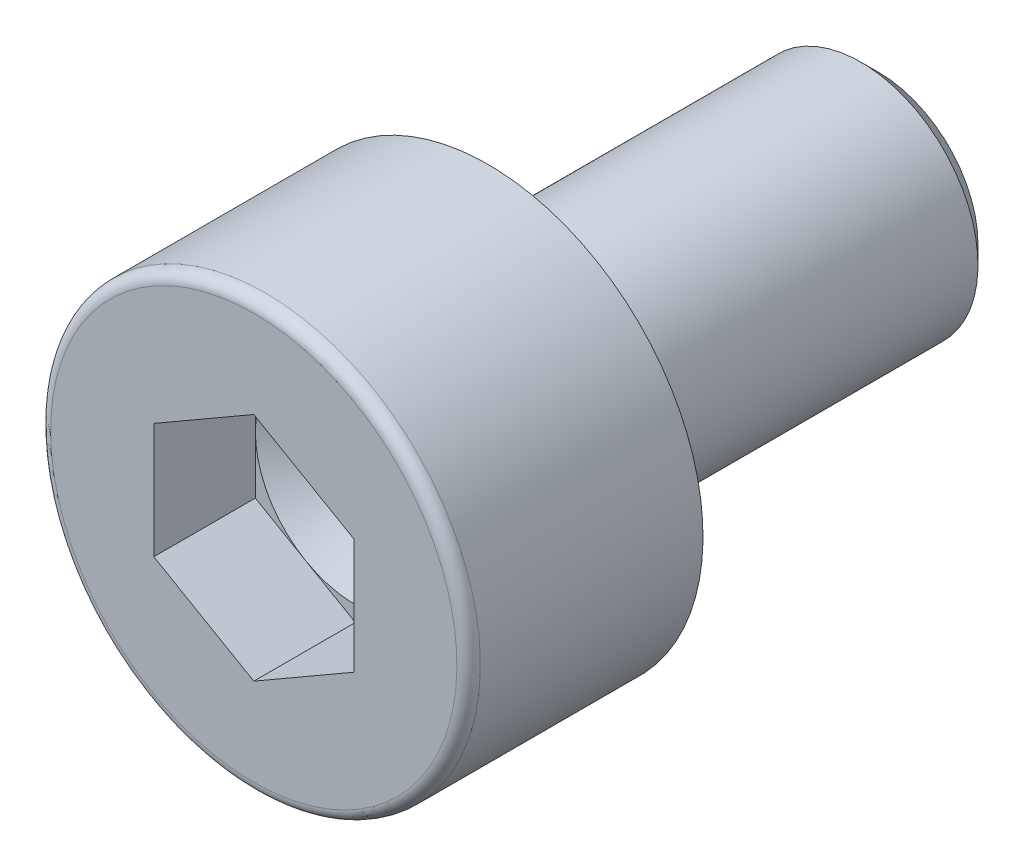
ISO-10303-21;
HEADER;
FILE_DESCRIPTION(('STEP AP214'),'2;1');
FILE_NAME('part.step','',(''),(''),'','','');
FILE_SCHEMA(('AUTOMOTIVE_DESIGN { 1 0 10303 214 1 1 1 1 }'));
ENDSEC;
DATA;
#1=APPLICATION_CONTEXT('core data for automotive mechanical design processes');
#2=APPLICATION_PROTOCOL_DEFINITION('international standard','automotive_design',2000,#1);
#3=PRODUCT_CONTEXT('',#1,'mechanical');
#4=PRODUCT('Part','Part','',(#3));
#5=PRODUCT_RELATED_PRODUCT_CATEGORY('part','',(#4));
#6=PRODUCT_DEFINITION_FORMATION('','',#4);
#7=PRODUCT_DEFINITION_CONTEXT('part definition',#1,'design');
#8=PRODUCT_DEFINITION('design','',#6,#7);
#9=PRODUCT_DEFINITION_SHAPE('','',#8);
#10=(LENGTH_UNIT() NAMED_UNIT(*) SI_UNIT(.MILLI.,.METRE.));
#11=(NAMED_UNIT(*) PLANE_ANGLE_UNIT() SI_UNIT($,.RADIAN.));
#12=(NAMED_UNIT(*) SI_UNIT($,.STERADIAN.) SOLID_ANGLE_UNIT());
#13=UNCERTAINTY_MEASURE_WITH_UNIT(LENGTH_MEASURE(1.E-05),#10,'distance_accuracy_value','');
#14=(GEOMETRIC_REPRESENTATION_CONTEXT(3) GLOBAL_UNCERTAINTY_ASSIGNED_CONTEXT((#13)) GLOBAL_UNIT_ASSIGNED_CONTEXT((#10,
#11,#12)) REPRESENTATION_CONTEXT('',''));
#15=CARTESIAN_POINT('',(0.,0.,0.));
#16=DIRECTION('',(0.,0.,1.));
#17=DIRECTION('',(1.,0.,0.));
#18=AXIS2_PLACEMENT_3D('',#15,#16,#17);
#19=CARTESIAN_POINT('',(0.,1.47801668912544,1.7));
#20=DIRECTION('',(0.,0.,1.));
#21=DIRECTION('',(1.,0.,0.));
#22=AXIS2_PLACEMENT_3D('',#19,#20,#21);
#23=PLANE('',#22);
#24=DIRECTION('',(0.,-1.,0.));
#25=VECTOR('',#24,1.);
#26=CARTESIAN_POINT('',(-1.28,0.739008344562725,1.7));
#27=LINE('',#26,#25);
#28=CARTESIAN_POINT('',(-1.28,0.739008344562725,1.7));
#29=VERTEX_POINT('',#28);
#30=CARTESIAN_POINT('',(-1.28,0.,1.7));
#31=VERTEX_POINT('',#30);
#32=EDGE_CURVE('E145',#29,#31,#27,.T.);
#33=ORIENTED_EDGE('',*,*,#32,.T.);
#34=CARTESIAN_POINT('',(0.,0.,1.7));
#35=DIRECTION('',(0.,0.,-1.));
#36=DIRECTION('',(-1.,0.,0.));
#37=AXIS2_PLACEMENT_3D('',#34,#35,#36);
#38=CIRCLE('',#37,1.28);
#39=CARTESIAN_POINT('',(-0.64,1.10851251684409,1.7));
#40=VERTEX_POINT('',#39);
#41=EDGE_CURVE('E28',#31,#40,#38,.T.);
#42=ORIENTED_EDGE('',*,*,#41,.T.);
#43=DIRECTION('',(-0.866025403784439,-0.5,0.));
#44=VECTOR('',#43,1.);
#45=CARTESIAN_POINT('',(0.,1.47801668912544,1.7));
#46=LINE('',#45,#44);
#47=EDGE_CURVE('E209',#40,#29,#46,.T.);
#48=ORIENTED_EDGE('',*,*,#47,.T.);
#49=EDGE_LOOP('',(#33,#42,#48));
#50=FACE_BOUND('',#49,.T.);
#51=ADVANCED_FACE('F17',(#50),#23,.T.);
#52=CARTESIAN_POINT('',(0.,1.47801668912544,1.7));
#53=VERTEX_POINT('',#52);
#54=EDGE_CURVE('E214',#53,#40,#46,.T.);
#55=ORIENTED_EDGE('',*,*,#54,.T.);
#56=CARTESIAN_POINT('',(0.64,1.10851251684409,1.7));
#57=VERTEX_POINT('',#56);
#58=EDGE_CURVE('E11',#40,#57,#38,.T.);
#59=ORIENTED_EDGE('',*,*,#58,.T.);
#60=DIRECTION('',(-0.866025403784439,0.5,0.));
#61=VECTOR('',#60,1.);
#62=CARTESIAN_POINT('',(1.28,0.739008344562725,1.7));
#63=LINE('',#62,#61);
#64=EDGE_CURVE('E171',#57,#53,#63,.T.);
#65=ORIENTED_EDGE('',*,*,#64,.T.);
#66=EDGE_LOOP('',(#55,#59,#65));
#67=FACE_BOUND('',#66,.T.);
#68=ADVANCED_FACE('F106',(#67),#23,.T.);
#69=CARTESIAN_POINT('',(1.28,0.739008344562725,1.7));
#70=VERTEX_POINT('',#69);
#71=EDGE_CURVE('E215',#70,#57,#63,.T.);
#72=ORIENTED_EDGE('',*,*,#71,.T.);
#73=CARTESIAN_POINT('',(1.28,0.,1.7));
#74=VERTEX_POINT('',#73);
#75=EDGE_CURVE('E26',#57,#74,#38,.T.);
#76=ORIENTED_EDGE('',*,*,#75,.T.);
#77=DIRECTION('',(0.,1.,0.));
#78=VECTOR('',#77,1.);
#79=CARTESIAN_POINT('',(1.28,-0.739008344562725,1.7));
#80=LINE('',#79,#78);
#81=EDGE_CURVE('E150',#74,#70,#80,.T.);
#82=ORIENTED_EDGE('',*,*,#81,.T.);
#83=EDGE_LOOP('',(#72,#76,#82));
#84=FACE_BOUND('',#83,.T.);
#85=ADVANCED_FACE('F113',(#84),#23,.T.);
#86=CARTESIAN_POINT('',(1.28,-0.739008344562725,1.7));
#87=VERTEX_POINT('',#86);
#88=EDGE_CURVE('E151',#87,#74,#80,.T.);
#89=ORIENTED_EDGE('',*,*,#88,.T.);
#90=CARTESIAN_POINT('',(0.64,-1.10851251684409,1.7));
#91=VERTEX_POINT('',#90);
#92=EDGE_CURVE('E206',#74,#91,#38,.T.);
#93=ORIENTED_EDGE('',*,*,#92,.T.);
#94=DIRECTION('',(0.866025403784439,0.5,0.));
#95=VECTOR('',#94,1.);
#96=CARTESIAN_POINT('',(0.,-1.47801668912544,1.7));
#97=LINE('',#96,#95);
#98=EDGE_CURVE('E140',#91,#87,#97,.T.);
#99=ORIENTED_EDGE('',*,*,#98,.T.);
#100=EDGE_LOOP('',(#89,#93,#99));
#101=FACE_BOUND('',#100,.T.);
#102=ADVANCED_FACE('F129',(#101),#23,.T.);
#103=CARTESIAN_POINT('',(0.,-1.47801668912544,1.7));
#104=VERTEX_POINT('',#103);
#105=EDGE_CURVE('E143',#104,#91,#97,.T.);
#106=ORIENTED_EDGE('',*,*,#105,.T.);
#107=CARTESIAN_POINT('',(-0.64,-1.10851251684409,1.7));
#108=VERTEX_POINT('',#107);
#109=EDGE_CURVE('E204',#91,#108,#38,.T.);
#110=ORIENTED_EDGE('',*,*,#109,.T.);
#111=DIRECTION('',(0.866025403784439,-0.5,0.));
#112=VECTOR('',#111,1.);
#113=CARTESIAN_POINT('',(-1.28,-0.739008344562725,1.7));
#114=LINE('',#113,#112);
#115=EDGE_CURVE('E141',#108,#104,#114,.T.);
#116=ORIENTED_EDGE('',*,*,#115,.T.);
#117=EDGE_LOOP('',(#106,#110,#116));
#118=FACE_BOUND('',#117,.T.);
#119=ADVANCED_FACE('F119',(#118),#23,.T.);
#120=CARTESIAN_POINT('',(-1.28,-0.739008344562725,1.7));
#121=VERTEX_POINT('',#120);
#122=EDGE_CURVE('E133',#121,#108,#114,.T.);
#123=ORIENTED_EDGE('',*,*,#122,.T.);
#124=EDGE_CURVE('E134',#108,#31,#38,.T.);
#125=ORIENTED_EDGE('',*,*,#124,.T.);
#126=EDGE_CURVE('E136',#31,#121,#27,.T.);
#127=ORIENTED_EDGE('',*,*,#126,.T.);
#128=EDGE_LOOP('',(#123,#125,#127));
#129=FACE_BOUND('',#128,.T.);
#130=ADVANCED_FACE('F108',(#129),#23,.T.);
#131=CARTESIAN_POINT('',(0.,0.,3.));
#132=DIRECTION('',(0.,0.,-1.));
#133=DIRECTION('',(0.,1.,0.));
#134=AXIS2_PLACEMENT_3D('',#131,#132,#133);
#135=PLANE('',#134);
#136=DIRECTION('',(-0.866025403784439,-0.5,0.));
#137=VECTOR('',#136,1.);
#138=CARTESIAN_POINT('',(0.,1.47801668912544,3.));
#139=LINE('',#138,#137);
#140=CARTESIAN_POINT('',(0.,1.47801668912544,3.));
#141=VERTEX_POINT('',#140);
#142=CARTESIAN_POINT('',(-1.28,0.739008344562725,3.));
#143=VERTEX_POINT('',#142);
#144=EDGE_CURVE('E156',#141,#143,#139,.T.);
#145=ORIENTED_EDGE('',*,*,#144,.F.);
#146=DIRECTION('',(-0.866025403784439,0.5,0.));
#147=VECTOR('',#146,1.);
#148=CARTESIAN_POINT('',(1.28,0.739008344562725,3.));
#149=LINE('',#148,#147);
#150=CARTESIAN_POINT('',(1.28,0.739008344562725,3.));
#151=VERTEX_POINT('',#150);
#152=EDGE_CURVE('E42',#151,#141,#149,.T.);
#153=ORIENTED_EDGE('',*,*,#152,.F.);
#154=DIRECTION('',(0.,1.,0.));
#155=VECTOR('',#154,1.);
#156=CARTESIAN_POINT('',(1.28,-0.739008344562725,3.));
#157=LINE('',#156,#155);
#158=CARTESIAN_POINT('',(1.28,-0.739008344562725,3.));
#159=VERTEX_POINT('',#158);
#160=EDGE_CURVE('E168',#159,#151,#157,.T.);
#161=ORIENTED_EDGE('',*,*,#160,.F.);
#162=DIRECTION('',(0.866025403784439,0.5,0.));
#163=VECTOR('',#162,1.);
#164=CARTESIAN_POINT('',(0.,-1.47801668912544,3.));
#165=LINE('',#164,#163);
#166=CARTESIAN_POINT('',(0.,-1.47801668912544,3.));
#167=VERTEX_POINT('',#166);
#168=EDGE_CURVE('E165',#167,#159,#165,.T.);
#169=ORIENTED_EDGE('',*,*,#168,.F.);
#170=DIRECTION('',(0.866025403784439,-0.5,0.));
#171=VECTOR('',#170,1.);
#172=CARTESIAN_POINT('',(-1.28,-0.739008344562725,3.));
#173=LINE('',#172,#171);
#174=CARTESIAN_POINT('',(-1.28,-0.739008344562725,3.));
#175=VERTEX_POINT('',#174);
#176=EDGE_CURVE('E162',#175,#167,#173,.T.);
#177=ORIENTED_EDGE('',*,*,#176,.F.);
#178=DIRECTION('',(0.,-1.,0.));
#179=VECTOR('',#178,1.);
#180=CARTESIAN_POINT('',(-1.28,0.739008344562725,3.));
#181=LINE('',#180,#179);
#182=EDGE_CURVE('E159',#143,#175,#181,.T.);
#183=ORIENTED_EDGE('',*,*,#182,.F.);
#184=EDGE_LOOP('',(#145,#153,#161,#169,#177,#183));
#185=FACE_BOUND('',#184,.T.);
#186=CARTESIAN_POINT('',(0.,0.,3.));
#187=DIRECTION('',(0.,0.,-1.));
#188=DIRECTION('',(0.,1.,0.));
#189=AXIS2_PLACEMENT_3D('',#186,#187,#188);
#190=CIRCLE('',#189,2.6);
#191=CARTESIAN_POINT('',(0.,2.6,3.));
#192=VERTEX_POINT('',#191);
#193=EDGE_CURVE('E192',#192,#192,#190,.F.);
#194=ORIENTED_EDGE('',*,*,#193,.T.);
#195=EDGE_LOOP('',(#194));
#196=FACE_BOUND('',#195,.T.);
#197=ADVANCED_FACE('F118',(#185,#196),#135,.F.);
#198=CARTESIAN_POINT('',(0.,0.,3.));
#199=DIRECTION('',(0.,0.,1.));
#200=DIRECTION('',(0.,-1.,0.));
#201=AXIS2_PLACEMENT_3D('',#198,#199,#200);
#202=CYLINDRICAL_SURFACE('',#201,2.75);
#203=CARTESIAN_POINT('',(0.,0.,2.85));
#204=DIRECTION('',(0.,0.,-1.));
#205=DIRECTION('',(0.,1.,0.));
#206=AXIS2_PLACEMENT_3D('',#203,#204,#205);
#207=CIRCLE('',#206,2.75);
#208=CARTESIAN_POINT('',(0.,2.75,2.85));
#209=VERTEX_POINT('',#208);
#210=EDGE_CURVE('E195',#209,#209,#207,.T.);
#211=ORIENTED_EDGE('',*,*,#210,.T.);
#212=EDGE_LOOP('',(#211));
#213=FACE_BOUND('',#212,.T.);
#214=CARTESIAN_POINT('',(0.,0.,0.));
#215=DIRECTION('',(0.,0.,1.));
#216=DIRECTION('',(0.,-1.,0.));
#217=AXIS2_PLACEMENT_3D('',#214,#215,#216);
#218=CIRCLE('',#217,2.75);
#219=CARTESIAN_POINT('',(0.,-2.75,0.));
#220=VERTEX_POINT('',#219);
#221=EDGE_CURVE('E174',#220,#220,#218,.T.);
#222=ORIENTED_EDGE('',*,*,#221,.T.);
#223=EDGE_LOOP('',(#222));
#224=FACE_BOUND('',#223,.T.);
#225=ADVANCED_FACE('F126',(#213,#224),#202,.T.);
#226=CARTESIAN_POINT('',(0.,2.75,0.));
#227=DIRECTION('',(0.,0.,1.));
#228=DIRECTION('',(0.,-1.,0.));
#229=AXIS2_PLACEMENT_3D('',#226,#227,#228);
#230=PLANE('',#229);
#231=CARTESIAN_POINT('',(0.,0.,0.));
#232=DIRECTION('',(0.,0.,1.));
#233=DIRECTION('',(0.,-1.,0.));
#234=AXIS2_PLACEMENT_3D('',#231,#232,#233);
#235=CIRCLE('',#234,1.6);
#236=CARTESIAN_POINT('',(0.,-1.6,0.));
#237=VERTEX_POINT('',#236);
#238=EDGE_CURVE('E197',#237,#237,#235,.T.);
#239=ORIENTED_EDGE('',*,*,#238,.T.);
#240=EDGE_LOOP('',(#239));
#241=FACE_BOUND('',#240,.T.);
#242=ORIENTED_EDGE('',*,*,#221,.F.);
#243=EDGE_LOOP('',(#242));
#244=FACE_BOUND('',#243,.T.);
#245=ADVANCED_FACE('F264',(#241,#244),#230,.F.);
#246=CARTESIAN_POINT('',(0.,0.,3.));
#247=DIRECTION('',(0.,0.,1.));
#248=DIRECTION('',(0.,-1.,0.));
#249=AXIS2_PLACEMENT_3D('',#246,#247,#248);
#250=CYLINDRICAL_SURFACE('',#249,1.5);
#251=CARTESIAN_POINT('',(0.,0.,-0.1));
#252=DIRECTION('',(0.,0.,1.));
#253=DIRECTION('',(0.,-1.,0.));
#254=AXIS2_PLACEMENT_3D('',#251,#252,#253);
#255=CIRCLE('',#254,1.5);
#256=CARTESIAN_POINT('',(0.,-1.5,-0.1));
#257=VERTEX_POINT('',#256);
#258=EDGE_CURVE('E21',#257,#257,#255,.F.);
#259=ORIENTED_EDGE('',*,*,#258,.T.);
#260=EDGE_LOOP('',(#259));
#261=FACE_BOUND('',#260,.T.);
#262=CARTESIAN_POINT('',(0.,0.,-4.77));
#263=DIRECTION('',(0.,0.,1.));
#264=DIRECTION('',(0.,-1.,0.));
#265=AXIS2_PLACEMENT_3D('',#262,#263,#264);
#266=CIRCLE('',#265,1.5);
#267=CARTESIAN_POINT('',(0.,-1.5,-4.77));
#268=VERTEX_POINT('',#267);
#269=EDGE_CURVE('E186',#268,#268,#266,.T.);
#270=ORIENTED_EDGE('',*,*,#269,.T.);
#271=EDGE_LOOP('',(#270));
#272=FACE_BOUND('',#271,.T.);
#273=ADVANCED_FACE('F260',(#261,#272),#250,.T.);
#274=CARTESIAN_POINT('',(0.,1.5,-5.));
#275=DIRECTION('',(0.,0.,1.));
#276=DIRECTION('',(0.,-1.,0.));
#277=AXIS2_PLACEMENT_3D('',#274,#275,#276);
#278=PLANE('',#277);
#279=CARTESIAN_POINT('',(0.,0.,-5.));
#280=DIRECTION('',(0.,0.,1.));
#281=DIRECTION('',(0.,-1.,0.));
#282=AXIS2_PLACEMENT_3D('',#279,#280,#281);
#283=CIRCLE('',#282,1.27);
#284=CARTESIAN_POINT('',(0.,-1.27,-5.));
#285=VERTEX_POINT('',#284);
#286=EDGE_CURVE('E189',#285,#285,#283,.F.);
#287=ORIENTED_EDGE('',*,*,#286,.T.);
#288=EDGE_LOOP('',(#287));
#289=FACE_BOUND('',#288,.T.);
#290=ADVANCED_FACE('F256',(#289),#278,.F.);
#291=CARTESIAN_POINT('',(0.,0.,-4.77));
#292=DIRECTION('',(0.,0.,1.));
#293=DIRECTION('',(0.,-1.,0.));
#294=AXIS2_PLACEMENT_3D('',#291,#292,#293);
#295=CONICAL_SURFACE('',#294,1.5,0.785398163397453);
#296=ORIENTED_EDGE('',*,*,#286,.F.);
#297=EDGE_LOOP('',(#296));
#298=FACE_BOUND('',#297,.T.);
#299=ORIENTED_EDGE('',*,*,#269,.F.);
#300=EDGE_LOOP('',(#299));
#301=FACE_BOUND('',#300,.T.);
#302=ADVANCED_FACE('F259',(#298,#301),#295,.T.);
#303=CARTESIAN_POINT('',(0.,0.,2.85));
#304=DIRECTION('',(0.,0.,-1.));
#305=DIRECTION('',(0.,1.,0.));
#306=AXIS2_PLACEMENT_3D('',#303,#304,#305);
#307=TOROIDAL_SURFACE('',#306,2.6,0.15);
#308=ORIENTED_EDGE('',*,*,#210,.F.);
#309=EDGE_LOOP('',(#308));
#310=FACE_BOUND('',#309,.T.);
#311=ORIENTED_EDGE('',*,*,#193,.F.);
#312=EDGE_LOOP('',(#311));
#313=FACE_BOUND('',#312,.T.);
#314=ADVANCED_FACE('F271',(#310,#313),#307,.T.);
#315=CARTESIAN_POINT('',(0.,0.,-0.1));
#316=DIRECTION('',(0.,0.,1.));
#317=DIRECTION('',(0.,-1.,0.));
#318=AXIS2_PLACEMENT_3D('',#315,#316,#317);
#319=TOROIDAL_SURFACE('',#318,1.6,0.1);
#320=ORIENTED_EDGE('',*,*,#258,.F.);
#321=EDGE_LOOP('',(#320));
#322=FACE_BOUND('',#321,.T.);
#323=ORIENTED_EDGE('',*,*,#238,.F.);
#324=EDGE_LOOP('',(#323));
#325=FACE_BOUND('',#324,.T.);
#326=ADVANCED_FACE('F19',(#322,#325),#319,.F.);
#327=CARTESIAN_POINT('',(1.28,0.739008344562725,1.7));
#328=DIRECTION('',(0.5,0.866025403784439,0.));
#329=DIRECTION('',(-0.866025403784439,0.5,0.));
#330=AXIS2_PLACEMENT_3D('',#327,#328,#329);
#331=PLANE('',#330);
#332=ORIENTED_EDGE('',*,*,#152,.T.);
#333=DIRECTION('',(0.,0.,1.));
#334=VECTOR('',#333,1.);
#335=CARTESIAN_POINT('',(0.,1.47801668912544,1.7));
#336=LINE('',#335,#334);
#337=EDGE_CURVE('E154',#53,#141,#336,.T.);
#338=ORIENTED_EDGE('',*,*,#337,.F.);
#339=ORIENTED_EDGE('',*,*,#64,.F.);
#340=ORIENTED_EDGE('',*,*,#71,.F.);
#341=DIRECTION('',(0.,0.,1.));
#342=VECTOR('',#341,1.);
#343=CARTESIAN_POINT('',(1.28,0.739008344562725,1.7));
#344=LINE('',#343,#342);
#345=EDGE_CURVE('E172',#70,#151,#344,.T.);
#346=ORIENTED_EDGE('',*,*,#345,.T.);
#347=EDGE_LOOP('',(#332,#338,#339,#340,#346));
#348=FACE_BOUND('',#347,.T.);
#349=ADVANCED_FACE('F223',(#348),#331,.F.);
#350=CARTESIAN_POINT('',(1.28,-0.739008344562725,1.7));
#351=DIRECTION('',(1.,0.,0.));
#352=DIRECTION('',(0.,1.,0.));
#353=AXIS2_PLACEMENT_3D('',#350,#351,#352);
#354=PLANE('',#353);
#355=ORIENTED_EDGE('',*,*,#160,.T.);
#356=ORIENTED_EDGE('',*,*,#345,.F.);
#357=ORIENTED_EDGE('',*,*,#81,.F.);
#358=ORIENTED_EDGE('',*,*,#88,.F.);
#359=DIRECTION('',(0.,0.,1.));
#360=VECTOR('',#359,1.);
#361=CARTESIAN_POINT('',(1.28,-0.739008344562725,1.7));
#362=LINE('',#361,#360);
#363=EDGE_CURVE('E175',#87,#159,#362,.T.);
#364=ORIENTED_EDGE('',*,*,#363,.T.);
#365=EDGE_LOOP('',(#355,#356,#357,#358,#364));
#366=FACE_BOUND('',#365,.T.);
#367=ADVANCED_FACE('F242',(#366),#354,.F.);
#368=CARTESIAN_POINT('',(0.,-1.47801668912544,1.7));
#369=DIRECTION('',(0.5,-0.866025403784439,0.));
#370=DIRECTION('',(0.866025403784439,0.5,0.));
#371=AXIS2_PLACEMENT_3D('',#368,#369,#370);
#372=PLANE('',#371);
#373=ORIENTED_EDGE('',*,*,#168,.T.);
#374=ORIENTED_EDGE('',*,*,#363,.F.);
#375=ORIENTED_EDGE('',*,*,#98,.F.);
#376=ORIENTED_EDGE('',*,*,#105,.F.);
#377=DIRECTION('',(0.,0.,1.));
#378=VECTOR('',#377,1.);
#379=CARTESIAN_POINT('',(0.,-1.47801668912544,1.7));
#380=LINE('',#379,#378);
#381=EDGE_CURVE('E177',#104,#167,#380,.T.);
#382=ORIENTED_EDGE('',*,*,#381,.T.);
#383=EDGE_LOOP('',(#373,#374,#375,#376,#382));
#384=FACE_BOUND('',#383,.T.);
#385=ADVANCED_FACE('F236',(#384),#372,.F.);
#386=CARTESIAN_POINT('',(-1.28,-0.739008344562725,1.7));
#387=DIRECTION('',(-0.5,-0.866025403784439,0.));
#388=DIRECTION('',(0.866025403784439,-0.5,0.));
#389=AXIS2_PLACEMENT_3D('',#386,#387,#388);
#390=PLANE('',#389);
#391=ORIENTED_EDGE('',*,*,#176,.T.);
#392=ORIENTED_EDGE('',*,*,#381,.F.);
#393=ORIENTED_EDGE('',*,*,#115,.F.);
#394=ORIENTED_EDGE('',*,*,#122,.F.);
#395=DIRECTION('',(0.,0.,1.));
#396=VECTOR('',#395,1.);
#397=CARTESIAN_POINT('',(-1.28,-0.739008344562725,1.7));
#398=LINE('',#397,#396);
#399=EDGE_CURVE('E179',#121,#175,#398,.T.);
#400=ORIENTED_EDGE('',*,*,#399,.T.);
#401=EDGE_LOOP('',(#391,#392,#393,#394,#400));
#402=FACE_BOUND('',#401,.T.);
#403=ADVANCED_FACE('F231',(#402),#390,.F.);
#404=CARTESIAN_POINT('',(-1.28,0.739008344562725,1.7));
#405=DIRECTION('',(-1.,0.,0.));
#406=DIRECTION('',(0.,0.,1.));
#407=AXIS2_PLACEMENT_3D('',#404,#405,#406);
#408=PLANE('',#407);
#409=ORIENTED_EDGE('',*,*,#182,.T.);
#410=ORIENTED_EDGE('',*,*,#399,.F.);
#411=ORIENTED_EDGE('',*,*,#126,.F.);
#412=ORIENTED_EDGE('',*,*,#32,.F.);
#413=DIRECTION('',(0.,0.,1.));
#414=VECTOR('',#413,1.);
#415=CARTESIAN_POINT('',(-1.28,0.739008344562725,1.7));
#416=LINE('',#415,#414);
#417=EDGE_CURVE('E181',#29,#143,#416,.T.);
#418=ORIENTED_EDGE('',*,*,#417,.T.);
#419=EDGE_LOOP('',(#409,#410,#411,#412,#418));
#420=FACE_BOUND('',#419,.T.);
#421=ADVANCED_FACE('F101',(#420),#408,.F.);
#422=CARTESIAN_POINT('',(0.,1.47801668912544,1.7));
#423=DIRECTION('',(-0.5,0.866025403784439,0.));
#424=DIRECTION('',(-0.866025403784439,-0.5,0.));
#425=AXIS2_PLACEMENT_3D('',#422,#423,#424);
#426=PLANE('',#425);
#427=ORIENTED_EDGE('',*,*,#144,.T.);
#428=ORIENTED_EDGE('',*,*,#417,.F.);
#429=ORIENTED_EDGE('',*,*,#47,.F.);
#430=ORIENTED_EDGE('',*,*,#54,.F.);
#431=ORIENTED_EDGE('',*,*,#337,.T.);
#432=EDGE_LOOP('',(#427,#428,#429,#430,#431));
#433=FACE_BOUND('',#432,.T.);
#434=ADVANCED_FACE('F94',(#433),#426,.F.);
#435=CARTESIAN_POINT('',(0.,0.,0.960991655437276));
#436=DIRECTION('',(0.,0.,1.));
#437=DIRECTION('',(1.,0.,0.));
#438=AXIS2_PLACEMENT_3D('',#435,#436,#437);
#439=CONICAL_SURFACE('',#438,0.,1.0471975511966);
#440=ORIENTED_EDGE('',*,*,#41,.F.);
#441=ORIENTED_EDGE('',*,*,#124,.F.);
#442=ORIENTED_EDGE('',*,*,#109,.F.);
#443=ORIENTED_EDGE('',*,*,#92,.F.);
#444=ORIENTED_EDGE('',*,*,#75,.F.);
#445=ORIENTED_EDGE('',*,*,#58,.F.);
#446=EDGE_LOOP('',(#440,#441,#442,#443,#444,#445));
#447=FACE_BOUND('',#446,.T.);
#448=CARTESIAN_POINT('',(0.,0.,0.960991655437276));
#449=VERTEX_POINT('',#448);
#450=VERTEX_LOOP('',#449);
#451=FACE_BOUND('',#450,.T.);
#452=ADVANCED_FACE('F92',(#447,#451),#439,.F.);
#453=CLOSED_SHELL('',(#51,#68,#85,#102,#119,#130,#197,#225,#245,#273,#290,#302,#314,#326,#349,
#367,#385,#403,#421,#434,#452));
#454=MANIFOLD_SOLID_BREP('B1',#453);
#455=ADVANCED_BREP_SHAPE_REPRESENTATION('',(#18,#454),#14);
#456=SHAPE_DEFINITION_REPRESENTATION(#9,#455);
ENDSEC;
END-ISO-10303-21;
